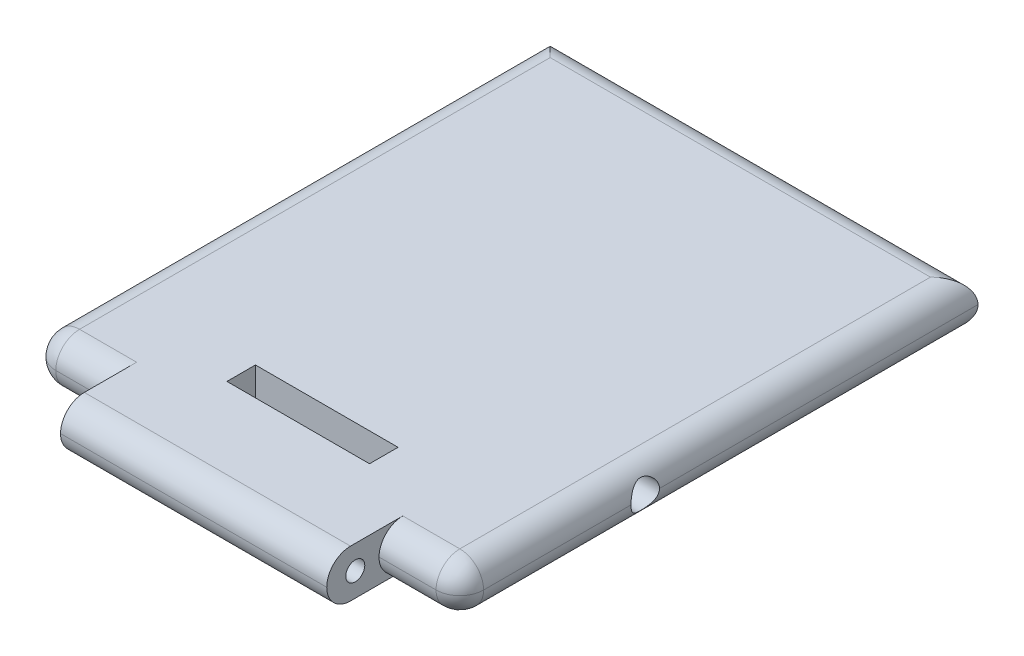
ISO-10303-21;
HEADER;
FILE_DESCRIPTION(('STEP AP214'),'2;1');
FILE_NAME('part.step','',(''),(''),'','','');
FILE_SCHEMA(('AUTOMOTIVE_DESIGN { 1 0 10303 214 1 1 1 1 }'));
ENDSEC;
DATA;
#1=APPLICATION_CONTEXT('core data for automotive mechanical design processes');
#2=APPLICATION_PROTOCOL_DEFINITION('international standard','automotive_design',2000,#1);
#3=PRODUCT_CONTEXT('',#1,'mechanical');
#4=PRODUCT('Part','Part','',(#3));
#5=PRODUCT_RELATED_PRODUCT_CATEGORY('part','',(#4));
#6=PRODUCT_DEFINITION_FORMATION('','',#4);
#7=PRODUCT_DEFINITION_CONTEXT('part definition',#1,'design');
#8=PRODUCT_DEFINITION('design','',#6,#7);
#9=PRODUCT_DEFINITION_SHAPE('','',#8);
#10=(LENGTH_UNIT() NAMED_UNIT(*) SI_UNIT(.MILLI.,.METRE.));
#11=(NAMED_UNIT(*) PLANE_ANGLE_UNIT() SI_UNIT($,.RADIAN.));
#12=(NAMED_UNIT(*) SI_UNIT($,.STERADIAN.) SOLID_ANGLE_UNIT());
#13=UNCERTAINTY_MEASURE_WITH_UNIT(LENGTH_MEASURE(1.E-05),#10,'distance_accuracy_value','');
#14=(GEOMETRIC_REPRESENTATION_CONTEXT(3) GLOBAL_UNCERTAINTY_ASSIGNED_CONTEXT((#13)) GLOBAL_UNIT_ASSIGNED_CONTEXT((#10,
#11,#12)) REPRESENTATION_CONTEXT('',''));
#15=CARTESIAN_POINT('',(0.,0.,0.));
#16=DIRECTION('',(0.,0.,1.));
#17=DIRECTION('',(1.,0.,0.));
#18=AXIS2_PLACEMENT_3D('',#15,#16,#17);
#19=CARTESIAN_POINT('',(-20.,0.,0.));
#20=DIRECTION('',(0.,0.,-1.));
#21=DIRECTION('',(-1.,0.,0.));
#22=AXIS2_PLACEMENT_3D('',#19,#20,#21);
#23=CYLINDRICAL_SURFACE('',#22,2.5);
#24=DIRECTION('',(0.,0.,1.));
#25=VECTOR('',#24,1.);
#26=CARTESIAN_POINT('',(-22.5,0.,-30.));
#27=LINE('',#26,#25);
#28=CARTESIAN_POINT('',(-22.5,0.,3.5));
#29=VERTEX_POINT('',#28);
#30=CARTESIAN_POINT('',(-22.5,0.,-30.));
#31=VERTEX_POINT('',#30);
#32=EDGE_CURVE('E176',#29,#31,#27,.F.);
#33=ORIENTED_EDGE('',*,*,#32,.F.);
#34=CARTESIAN_POINT('',(-22.5,0.,3.5));
#35=CARTESIAN_POINT('',(-22.5000044393078,0.0385814004818396,3.49999721546958));
#36=CARTESIAN_POINT('',(-22.4991059461024,0.0771415674825016,3.5014895912147));
#37=CARTESIAN_POINT('',(-22.4955516212392,0.153933720325979,3.50742294563337));
#38=CARTESIAN_POINT('',(-22.4928966764006,0.192165861924006,3.51186243633485));
#39=CARTESIAN_POINT('',(-22.4824133452094,0.305515608465147,3.52946602749674));
#40=CARTESIAN_POINT('',(-22.4720651518234,0.379786208449342,3.5469164948956));
#41=CARTESIAN_POINT('',(-22.4456254792361,0.523717422888231,3.59237010561794));
#42=CARTESIAN_POINT('',(-22.429543092635,0.593385129935151,3.62035654615306));
#43=CARTESIAN_POINT('',(-22.3929831093628,0.726933408093366,3.68580623368843));
#44=CARTESIAN_POINT('',(-22.3725002969015,0.790806982564218,3.72328073630663));
#45=CARTESIAN_POINT('',(-22.3270514917775,0.916306643350075,3.80977892638183));
#46=CARTESIAN_POINT('',(-22.3018633704501,0.977395457980457,3.85946268647684));
#47=CARTESIAN_POINT('',(-22.2502996304999,1.09089176245314,3.96747772201137));
#48=CARTESIAN_POINT('',(-22.223922723787,1.1432895329452,4.02581854254182));
#49=CARTESIAN_POINT('',(-22.1691105383343,1.24445033696731,4.15792383318339));
#50=CARTESIAN_POINT('',(-22.1408199117211,1.29197814210969,4.23270247276361));
#51=CARTESIAN_POINT('',(-22.0893827947207,1.37361466763903,4.39084735877262));
#52=CARTESIAN_POINT('',(-22.0662279351703,1.40774529078447,4.47419930489061));
#53=CARTESIAN_POINT('',(-22.0335463907735,1.45440588845967,4.62659601132903));
#54=CARTESIAN_POINT('',(-22.022078983889,1.47016176402116,4.69423509419494));
#55=CARTESIAN_POINT('',(-22.005903146887,1.49216163757828,4.83180278141852));
#56=CARTESIAN_POINT('',(-22.0011864032256,1.49841733576744,4.90172846100189));
#57=CARTESIAN_POINT('',(-21.9992092222717,1.50105509186428,5.04201164826098));
#58=CARTESIAN_POINT('',(-22.0019633823942,1.49741781983877,5.11236973295184));
#59=CARTESIAN_POINT('',(-22.0145326572401,1.48046054476459,5.25127907563448));
#60=CARTESIAN_POINT('',(-22.0243530522272,1.46713330077918,5.31982894269715));
#61=CARTESIAN_POINT('',(-22.0495319174815,1.43173915740479,5.45253049552673));
#62=CARTESIAN_POINT('',(-22.064817233501,1.40978734105082,5.5167275462438));
#63=CARTESIAN_POINT('',(-22.0992706633852,1.35795036175845,5.64069545879761));
#64=CARTESIAN_POINT('',(-22.1184401701158,1.32806235171398,5.70046472230596));
#65=CARTESIAN_POINT('',(-22.1625525993146,1.25518104106243,5.82498219388955));
#66=CARTESIAN_POINT('',(-22.1879189881197,1.21081016017397,5.88877444027665));
#67=CARTESIAN_POINT('',(-22.2393045609473,1.11291350322469,6.00867341086113));
#68=CARTESIAN_POINT('',(-22.2653243823146,1.05937846722629,6.06477225695369));
#69=CARTESIAN_POINT('',(-22.319359208429,0.935803921168379,6.17562140463223));
#70=CARTESIAN_POINT('',(-22.3471461878551,0.864503841812067,6.22909188290035));
#71=CARTESIAN_POINT('',(-22.3977314873248,0.712244675848721,6.32313540947742));
#72=CARTESIAN_POINT('',(-22.4205339367657,0.631293671068322,6.36371914642647));
#73=CARTESIAN_POINT('',(-22.4548196029919,0.478302472498111,6.42359184069723));
#74=CARTESIAN_POINT('',(-22.467639890452,0.407574199222205,6.4454830783274));
#75=CARTESIAN_POINT('',(-22.4871980344502,0.262934036845273,6.4786268437014));
#76=CARTESIAN_POINT('',(-22.4939506394922,0.18903032729998,6.48990517104717));
#77=CARTESIAN_POINT('',(-22.4982460622018,0.0955848699627612,6.49707482394523));
#78=CARTESIAN_POINT('',(-22.498903526115,0.0764812683724517,6.49817174191381));
#79=CARTESIAN_POINT('',(-22.4997798794058,0.0382541496933018,6.49963341977961));
#80=CARTESIAN_POINT('',(-22.4999991837261,0.0191306686226421,6.4999988723841));
#81=CARTESIAN_POINT('',(-22.5,0.,6.50000000000001));
#82=B_SPLINE_CURVE_WITH_KNOTS('',3,(#34,#35,#36,#37,#38,#39,#40,#41,#42,#43,#44,#45,#46,#47,#48,
#49,#50,#51,#52,#53,#54,#55,#56,#57,#58,#59,#60,#61,#62,#63,#64,#65,#66,#67,#68,#69,#70,#71,#72,
#73,#74,#75,#76,#77,#78,#79,#80,#81),.UNSPECIFIED.,.F.,.F.,(4,2,2,2,2,2,2,2,2,2,2,2,2,2,2,2,2,2,
2,2,2,2,2,4),(0.,0.115664120203099,0.231269886993216,0.461003678278137,0.690374793435718,
0.920019295308536,1.1670692627372,1.4143936745253,1.69207052751252,1.96929150285475,
2.17956799484947,2.38958530467528,2.60001326320507,2.81059862813212,3.01846457428348,
3.22640519324174,3.47069421075595,3.71523154357855,3.99388188884001,4.27230050596576,
4.49678090538653,4.72071418048354,4.77814150578977,4.83551442088689),.UNSPECIFIED.);
#83=CARTESIAN_POINT('',(-22.5,0.,6.50000000000001));
#84=VERTEX_POINT('',#83);
#85=EDGE_CURVE('E53',#29,#84,#82,.T.);
#86=ORIENTED_EDGE('',*,*,#85,.T.);
#87=CARTESIAN_POINT('',(-22.5,0.,22.));
#88=VERTEX_POINT('',#87);
#89=EDGE_CURVE('E173',#88,#84,#27,.F.);
#90=ORIENTED_EDGE('',*,*,#89,.F.);
#91=CARTESIAN_POINT('',(-20.,0.,22.));
#92=DIRECTION('',(0.,0.,1.));
#93=DIRECTION('',(1.,0.,0.));
#94=AXIS2_PLACEMENT_3D('',#91,#92,#93);
#95=CIRCLE('',#94,2.5);
#96=CARTESIAN_POINT('',(-20.,2.5,22.));
#97=VERTEX_POINT('',#96);
#98=EDGE_CURVE('E194',#88,#97,#95,.F.);
#99=ORIENTED_EDGE('',*,*,#98,.T.);
#100=DIRECTION('',(0.,0.,1.));
#101=VECTOR('',#100,1.);
#102=CARTESIAN_POINT('',(-20.,2.5,24.5));
#103=LINE('',#102,#101);
#104=CARTESIAN_POINT('',(-20.,2.5,-27.5));
#105=VERTEX_POINT('',#104);
#106=EDGE_CURVE('E611',#105,#97,#103,.T.);
#107=ORIENTED_EDGE('',*,*,#106,.F.);
#108=CARTESIAN_POINT('',(-20.,0.,-27.5));
#109=DIRECTION('',(0.707106781186547,0.,-0.707106781186548));
#110=DIRECTION('',(0.707106781186547,0.,0.707106781186547));
#111=AXIS2_PLACEMENT_3D('',#108,#109,#110);
#112=ELLIPSE('',#111,3.53553390593274,2.5);
#113=EDGE_CURVE('E184',#31,#105,#112,.T.);
#114=ORIENTED_EDGE('',*,*,#113,.F.);
#115=EDGE_LOOP('',(#33,#86,#90,#99,#107,#114));
#116=FACE_BOUND('',#115,.T.);
#117=ADVANCED_FACE('F33',(#116),#23,.T.);
#118=CARTESIAN_POINT('',(-20.,0.,-30.));
#119=DIRECTION('',(0.,0.,1.));
#120=DIRECTION('',(1.,0.,0.));
#121=AXIS2_PLACEMENT_3D('',#118,#119,#120);
#122=CYLINDRICAL_SURFACE('',#121,2.5);
#123=ORIENTED_EDGE('',*,*,#89,.T.);
#124=CARTESIAN_POINT('',(-22.5,0.,6.50000000000001));
#125=CARTESIAN_POINT('',(-22.5000044393078,-0.0385814004818392,6.50000278453043));
#126=CARTESIAN_POINT('',(-22.4991059461024,-0.0771415674825013,6.49851040878531));
#127=CARTESIAN_POINT('',(-22.4955516212392,-0.153933720325979,6.49257705436664));
#128=CARTESIAN_POINT('',(-22.4928966764006,-0.192165861924006,6.48813756366516));
#129=CARTESIAN_POINT('',(-22.4824133452094,-0.305515608465147,6.47053397250327));
#130=CARTESIAN_POINT('',(-22.4720651518234,-0.379786208449342,6.45308350510441));
#131=CARTESIAN_POINT('',(-22.4456254792361,-0.523717422888231,6.40762989438207));
#132=CARTESIAN_POINT('',(-22.429543092635,-0.593385129935151,6.37964345384695));
#133=CARTESIAN_POINT('',(-22.3929831093628,-0.726933408093366,6.31419376631158));
#134=CARTESIAN_POINT('',(-22.3725002969015,-0.790806982564218,6.27671926369338));
#135=CARTESIAN_POINT('',(-22.3270514917775,-0.916306643350075,6.19022107361818));
#136=CARTESIAN_POINT('',(-22.3018633704501,-0.977395457980457,6.14053731352317));
#137=CARTESIAN_POINT('',(-22.2502996305,-1.09089176245313,6.03252227798864));
#138=CARTESIAN_POINT('',(-22.223922723787,-1.1432895329452,5.97418145745819));
#139=CARTESIAN_POINT('',(-22.1691105383343,-1.24445033696731,5.84207616681662));
#140=CARTESIAN_POINT('',(-22.1408199117211,-1.29197814210969,5.7672975272364));
#141=CARTESIAN_POINT('',(-22.0893827947207,-1.37361466763903,5.60915264122738));
#142=CARTESIAN_POINT('',(-22.0662279351703,-1.40774529078447,5.5258006951094));
#143=CARTESIAN_POINT('',(-22.0335463907735,-1.45440588845967,5.37340398867098));
#144=CARTESIAN_POINT('',(-22.022078983889,-1.47016176402116,5.30576490580506));
#145=CARTESIAN_POINT('',(-22.005903146887,-1.49216163757828,5.16819721858149));
#146=CARTESIAN_POINT('',(-22.0011864032256,-1.49841733576744,5.09827153899811));
#147=CARTESIAN_POINT('',(-21.9992092222717,-1.50105509186428,4.95798835173902));
#148=CARTESIAN_POINT('',(-22.0019633823942,-1.49741781983877,4.88763026704816));
#149=CARTESIAN_POINT('',(-22.0145326572401,-1.48046054476459,4.74872092436553));
#150=CARTESIAN_POINT('',(-22.0243530522272,-1.46713330077918,4.68017105730286));
#151=CARTESIAN_POINT('',(-22.0495319174815,-1.43173915740478,4.54746950447328));
#152=CARTESIAN_POINT('',(-22.064817233501,-1.40978734105082,4.48327245375621));
#153=CARTESIAN_POINT('',(-22.0992706633852,-1.35795036175845,4.3593045412024));
#154=CARTESIAN_POINT('',(-22.1184401701158,-1.32806235171398,4.29953527769404));
#155=CARTESIAN_POINT('',(-22.1625525993146,-1.25518104106243,4.17501780611045));
#156=CARTESIAN_POINT('',(-22.1879189881197,-1.21081016017397,4.11122555972335));
#157=CARTESIAN_POINT('',(-22.2393045609473,-1.11291350322469,3.99132658913888));
#158=CARTESIAN_POINT('',(-22.2653243823147,-1.05937846722629,3.93522774304632));
#159=CARTESIAN_POINT('',(-22.319359208429,-0.935803921168375,3.82437859536778));
#160=CARTESIAN_POINT('',(-22.3471461878551,-0.864503841812062,3.77090811709966));
#161=CARTESIAN_POINT('',(-22.3977314873248,-0.712244675848716,3.67686459052259));
#162=CARTESIAN_POINT('',(-22.4205339367657,-0.631293671068317,3.63628085357354));
#163=CARTESIAN_POINT('',(-22.4548196029919,-0.478302472498106,3.57640815930278));
#164=CARTESIAN_POINT('',(-22.467639890452,-0.407574199222199,3.55451692167261));
#165=CARTESIAN_POINT('',(-22.4871980344502,-0.262934036845267,3.5213731562986));
#166=CARTESIAN_POINT('',(-22.4939506394922,-0.189030327299974,3.51009482895284));
#167=CARTESIAN_POINT('',(-22.4982460622018,-0.0955848699627559,3.50292517605478));
#168=CARTESIAN_POINT('',(-22.498903526115,-0.0764812683724476,3.5018282580862));
#169=CARTESIAN_POINT('',(-22.4997798794059,-0.0382541496932998,3.5003665802204));
#170=CARTESIAN_POINT('',(-22.4999991837261,-0.019130668622641,3.50000112761591));
#171=CARTESIAN_POINT('',(-22.5,0.,3.5));
#172=B_SPLINE_CURVE_WITH_KNOTS('',3,(#124,#125,#126,#127,#128,#129,#130,#131,#132,#133,#134,
#135,#136,#137,#138,#139,#140,#141,#142,#143,#144,#145,#146,#147,#148,#149,#150,#151,#152,#153,
#154,#155,#156,#157,#158,#159,#160,#161,#162,#163,#164,#165,#166,#167,#168,#169,#170,#171),
.UNSPECIFIED.,.F.,.F.,(4,2,2,2,2,2,2,2,2,2,2,2,2,2,2,2,2,2,2,2,2,2,2,4),(0.,0.115664120203099,
0.231269886993216,0.461003678278138,0.690374793435719,0.920019295308536,1.1670692627372,
1.4143936745253,1.69207052751252,1.96929150285475,2.17956799484947,2.38958530467528,
2.60001326320508,2.81059862813213,3.01846457428349,3.22640519324175,3.47069421075596,
3.71523154357855,3.99388188884002,4.27230050596577,4.49678090538653,4.72071418048355,
4.77814150578978,4.83551442088689),.UNSPECIFIED.);
#173=EDGE_CURVE('E11',#84,#29,#172,.T.);
#174=ORIENTED_EDGE('',*,*,#173,.T.);
#175=ORIENTED_EDGE('',*,*,#32,.T.);
#176=CARTESIAN_POINT('',(-20.,0.,-27.5));
#177=DIRECTION('',(-0.707106781186547,0.,0.707106781186548));
#178=DIRECTION('',(0.707106781186547,0.,0.707106781186547));
#179=AXIS2_PLACEMENT_3D('',#176,#177,#178);
#180=ELLIPSE('',#179,3.53553390593274,2.5);
#181=CARTESIAN_POINT('',(-20.,-2.5,-27.5));
#182=VERTEX_POINT('',#181);
#183=EDGE_CURVE('E590',#182,#31,#180,.F.);
#184=ORIENTED_EDGE('',*,*,#183,.F.);
#185=DIRECTION('',(0.,0.,1.));
#186=VECTOR('',#185,1.);
#187=CARTESIAN_POINT('',(-20.,-2.5,0.));
#188=LINE('',#187,#186);
#189=CARTESIAN_POINT('',(-20.,-2.5,22.));
#190=VERTEX_POINT('',#189);
#191=EDGE_CURVE('E609',#190,#182,#188,.F.);
#192=ORIENTED_EDGE('',*,*,#191,.F.);
#193=CARTESIAN_POINT('',(-20.,0.,22.));
#194=DIRECTION('',(0.,0.,1.));
#195=DIRECTION('',(0.,-1.,0.));
#196=AXIS2_PLACEMENT_3D('',#193,#194,#195);
#197=CIRCLE('',#196,2.5);
#198=EDGE_CURVE('E183',#190,#88,#197,.F.);
#199=ORIENTED_EDGE('',*,*,#198,.T.);
#200=EDGE_LOOP('',(#123,#174,#175,#184,#192,#199));
#201=FACE_BOUND('',#200,.T.);
#202=ADVANCED_FACE('F180',(#201),#122,.T.);
#203=CARTESIAN_POINT('',(0.,2.5,0.));
#204=DIRECTION('',(0.,1.,0.));
#205=DIRECTION('',(0.,0.,1.));
#206=AXIS2_PLACEMENT_3D('',#203,#204,#205);
#207=PLANE('',#206);
#208=DIRECTION('',(0.,0.,1.));
#209=VECTOR('',#208,1.);
#210=CARTESIAN_POINT('',(7.5,2.5,19.));
#211=LINE('',#210,#209);
#212=CARTESIAN_POINT('',(7.5,2.5,16.));
#213=VERTEX_POINT('',#212);
#214=CARTESIAN_POINT('',(7.5,2.5,19.));
#215=VERTEX_POINT('',#214);
#216=EDGE_CURVE('E246',#213,#215,#211,.T.);
#217=ORIENTED_EDGE('',*,*,#216,.T.);
#218=DIRECTION('',(-1.,0.,0.));
#219=VECTOR('',#218,1.);
#220=CARTESIAN_POINT('',(-7.5,2.5,19.));
#221=LINE('',#220,#219);
#222=CARTESIAN_POINT('',(-7.5,2.5,19.));
#223=VERTEX_POINT('',#222);
#224=EDGE_CURVE('E658',#215,#223,#221,.T.);
#225=ORIENTED_EDGE('',*,*,#224,.T.);
#226=DIRECTION('',(0.,0.,-1.));
#227=VECTOR('',#226,1.);
#228=CARTESIAN_POINT('',(-7.5,2.5,19.));
#229=LINE('',#228,#227);
#230=CARTESIAN_POINT('',(-7.5,2.5,16.));
#231=VERTEX_POINT('',#230);
#232=EDGE_CURVE('E656',#223,#231,#229,.T.);
#233=ORIENTED_EDGE('',*,*,#232,.T.);
#234=DIRECTION('',(1.,0.,0.));
#235=VECTOR('',#234,1.);
#236=CARTESIAN_POINT('',(-7.5,2.5,16.));
#237=LINE('',#236,#235);
#238=EDGE_CURVE('E647',#231,#213,#237,.T.);
#239=ORIENTED_EDGE('',*,*,#238,.T.);
#240=EDGE_LOOP('',(#217,#225,#233,#239));
#241=FACE_BOUND('',#240,.T.);
#242=DIRECTION('',(0.,0.,-1.));
#243=VECTOR('',#242,1.);
#244=CARTESIAN_POINT('',(-14.,2.5,0.));
#245=LINE('',#244,#243);
#246=CARTESIAN_POINT('',(-14.,2.5,27.5));
#247=VERTEX_POINT('',#246);
#248=CARTESIAN_POINT('',(-14.,2.5,22.));
#249=VERTEX_POINT('',#248);
#250=EDGE_CURVE('E532',#247,#249,#245,.T.);
#251=ORIENTED_EDGE('',*,*,#250,.F.);
#252=DIRECTION('',(1.,0.,0.));
#253=VECTOR('',#252,1.);
#254=CARTESIAN_POINT('',(14.,2.5,27.5));
#255=LINE('',#254,#253);
#256=CARTESIAN_POINT('',(14.,2.5,27.5));
#257=VERTEX_POINT('',#256);
#258=EDGE_CURVE('E534',#247,#257,#255,.T.);
#259=ORIENTED_EDGE('',*,*,#258,.T.);
#260=DIRECTION('',(0.,0.,-1.));
#261=VECTOR('',#260,1.);
#262=CARTESIAN_POINT('',(14.,2.5,0.));
#263=LINE('',#262,#261);
#264=CARTESIAN_POINT('',(14.,2.5,22.));
#265=VERTEX_POINT('',#264);
#266=EDGE_CURVE('E541',#257,#265,#263,.T.);
#267=ORIENTED_EDGE('',*,*,#266,.T.);
#268=DIRECTION('',(1.,0.,0.));
#269=VECTOR('',#268,1.);
#270=CARTESIAN_POINT('',(0.,2.5,22.));
#271=LINE('',#270,#269);
#272=CARTESIAN_POINT('',(20.,2.5,22.));
#273=VERTEX_POINT('',#272);
#274=EDGE_CURVE('E552',#265,#273,#271,.T.);
#275=ORIENTED_EDGE('',*,*,#274,.T.);
#276=DIRECTION('',(0.,0.,-1.));
#277=VECTOR('',#276,1.);
#278=CARTESIAN_POINT('',(20.,2.5,-30.));
#279=LINE('',#278,#277);
#280=CARTESIAN_POINT('',(20.,2.5,-27.5));
#281=VERTEX_POINT('',#280);
#282=EDGE_CURVE('E600',#273,#281,#279,.T.);
#283=ORIENTED_EDGE('',*,*,#282,.T.);
#284=DIRECTION('',(-1.,0.,0.));
#285=VECTOR('',#284,1.);
#286=CARTESIAN_POINT('',(-22.5,2.5,-27.5));
#287=LINE('',#286,#285);
#288=EDGE_CURVE('E603',#281,#105,#287,.T.);
#289=ORIENTED_EDGE('',*,*,#288,.T.);
#290=ORIENTED_EDGE('',*,*,#106,.T.);
#291=DIRECTION('',(-1.,0.,0.));
#292=VECTOR('',#291,1.);
#293=CARTESIAN_POINT('',(-14.,2.5,22.));
#294=LINE('',#293,#292);
#295=EDGE_CURVE('E537',#97,#249,#294,.F.);
#296=ORIENTED_EDGE('',*,*,#295,.T.);
#297=EDGE_LOOP('',(#251,#259,#267,#275,#283,#289,#290,#296));
#298=FACE_BOUND('',#297,.T.);
#299=ADVANCED_FACE('F258',(#241,#298),#207,.T.);
#300=CARTESIAN_POINT('',(0.,-2.5,0.));
#301=DIRECTION('',(0.,1.,0.));
#302=DIRECTION('',(0.,0.,1.));
#303=AXIS2_PLACEMENT_3D('',#300,#301,#302);
#304=PLANE('',#303);
#305=DIRECTION('',(1.,0.,0.));
#306=VECTOR('',#305,1.);
#307=CARTESIAN_POINT('',(0.,-2.5,19.));
#308=LINE('',#307,#306);
#309=CARTESIAN_POINT('',(-7.5,-2.5,19.));
#310=VERTEX_POINT('',#309);
#311=CARTESIAN_POINT('',(7.5,-2.5,19.));
#312=VERTEX_POINT('',#311);
#313=EDGE_CURVE('E206',#310,#312,#308,.T.);
#314=ORIENTED_EDGE('',*,*,#313,.T.);
#315=DIRECTION('',(0.,0.,-1.));
#316=VECTOR('',#315,1.);
#317=CARTESIAN_POINT('',(7.49999999999999,-2.5,0.));
#318=LINE('',#317,#316);
#319=CARTESIAN_POINT('',(7.5,-2.5,16.));
#320=VERTEX_POINT('',#319);
#321=EDGE_CURVE('E216',#312,#320,#318,.T.);
#322=ORIENTED_EDGE('',*,*,#321,.T.);
#323=DIRECTION('',(-1.,0.,0.));
#324=VECTOR('',#323,1.);
#325=CARTESIAN_POINT('',(0.,-2.5,16.));
#326=LINE('',#325,#324);
#327=CARTESIAN_POINT('',(-7.5,-2.5,16.));
#328=VERTEX_POINT('',#327);
#329=EDGE_CURVE('E213',#320,#328,#326,.T.);
#330=ORIENTED_EDGE('',*,*,#329,.T.);
#331=DIRECTION('',(0.,0.,1.));
#332=VECTOR('',#331,1.);
#333=CARTESIAN_POINT('',(-7.49999999999999,-2.5,0.));
#334=LINE('',#333,#332);
#335=EDGE_CURVE('E209',#328,#310,#334,.T.);
#336=ORIENTED_EDGE('',*,*,#335,.T.);
#337=EDGE_LOOP('',(#314,#322,#330,#336));
#338=FACE_BOUND('',#337,.T.);
#339=DIRECTION('',(0.,0.,-1.));
#340=VECTOR('',#339,1.);
#341=CARTESIAN_POINT('',(14.,-2.5,0.));
#342=LINE('',#341,#340);
#343=CARTESIAN_POINT('',(14.,-2.5,27.5));
#344=VERTEX_POINT('',#343);
#345=CARTESIAN_POINT('',(14.,-2.5,22.));
#346=VERTEX_POINT('',#345);
#347=EDGE_CURVE('E639',#344,#346,#342,.T.);
#348=ORIENTED_EDGE('',*,*,#347,.F.);
#349=DIRECTION('',(1.,0.,0.));
#350=VECTOR('',#349,1.);
#351=CARTESIAN_POINT('',(0.,-2.5,27.5));
#352=LINE('',#351,#350);
#353=CARTESIAN_POINT('',(-14.,-2.5,27.5));
#354=VERTEX_POINT('',#353);
#355=EDGE_CURVE('E619',#344,#354,#352,.F.);
#356=ORIENTED_EDGE('',*,*,#355,.T.);
#357=DIRECTION('',(0.,0.,-1.));
#358=VECTOR('',#357,1.);
#359=CARTESIAN_POINT('',(-14.,-2.5,0.));
#360=LINE('',#359,#358);
#361=CARTESIAN_POINT('',(-14.,-2.5,22.));
#362=VERTEX_POINT('',#361);
#363=EDGE_CURVE('E638',#354,#362,#360,.T.);
#364=ORIENTED_EDGE('',*,*,#363,.T.);
#365=DIRECTION('',(-1.,0.,0.));
#366=VECTOR('',#365,1.);
#367=CARTESIAN_POINT('',(0.,-2.5,22.));
#368=LINE('',#367,#366);
#369=EDGE_CURVE('E625',#362,#190,#368,.T.);
#370=ORIENTED_EDGE('',*,*,#369,.T.);
#371=ORIENTED_EDGE('',*,*,#191,.T.);
#372=DIRECTION('',(-1.,0.,0.));
#373=VECTOR('',#372,1.);
#374=CARTESIAN_POINT('',(0.,-2.5,-27.5));
#375=LINE('',#374,#373);
#376=CARTESIAN_POINT('',(20.,-2.5,-27.5));
#377=VERTEX_POINT('',#376);
#378=EDGE_CURVE('E608',#182,#377,#375,.F.);
#379=ORIENTED_EDGE('',*,*,#378,.T.);
#380=DIRECTION('',(0.,0.,-1.));
#381=VECTOR('',#380,1.);
#382=CARTESIAN_POINT('',(20.,-2.5,0.));
#383=LINE('',#382,#381);
#384=CARTESIAN_POINT('',(20.,-2.5,22.));
#385=VERTEX_POINT('',#384);
#386=EDGE_CURVE('E627',#377,#385,#383,.F.);
#387=ORIENTED_EDGE('',*,*,#386,.T.);
#388=DIRECTION('',(1.,0.,0.));
#389=VECTOR('',#388,1.);
#390=CARTESIAN_POINT('',(14.,-2.5,22.));
#391=LINE('',#390,#389);
#392=EDGE_CURVE('E622',#385,#346,#391,.F.);
#393=ORIENTED_EDGE('',*,*,#392,.T.);
#394=EDGE_LOOP('',(#348,#356,#364,#370,#371,#379,#387,#393));
#395=FACE_BOUND('',#394,.T.);
#396=ADVANCED_FACE('F445',(#338,#395),#304,.F.);
#397=CARTESIAN_POINT('',(14.,-2.5,0.));
#398=DIRECTION('',(1.,0.,0.));
#399=DIRECTION('',(0.,0.,-1.));
#400=AXIS2_PLACEMENT_3D('',#397,#398,#399);
#401=PLANE('',#400);
#402=CARTESIAN_POINT('',(14.,0.,27.));
#403=DIRECTION('',(1.,0.,0.));
#404=DIRECTION('',(0.,0.,-1.));
#405=AXIS2_PLACEMENT_3D('',#402,#403,#404);
#406=CIRCLE('',#405,1.);
#407=CARTESIAN_POINT('',(14.,0.,26.));
#408=VERTEX_POINT('',#407);
#409=EDGE_CURVE('E635',#408,#408,#406,.T.);
#410=ORIENTED_EDGE('',*,*,#409,.F.);
#411=EDGE_LOOP('',(#410));
#412=FACE_BOUND('',#411,.T.);
#413=CARTESIAN_POINT('',(14.,0.,27.5));
#414=DIRECTION('',(1.,0.,0.));
#415=DIRECTION('',(0.,0.,-1.));
#416=AXIS2_PLACEMENT_3D('',#413,#414,#415);
#417=CIRCLE('',#416,2.5);
#418=CARTESIAN_POINT('',(14.,0.,30.));
#419=VERTEX_POINT('',#418);
#420=EDGE_CURVE('E540',#257,#419,#417,.T.);
#421=ORIENTED_EDGE('',*,*,#420,.T.);
#422=CARTESIAN_POINT('',(14.,0.,27.5));
#423=DIRECTION('',(1.,0.,0.));
#424=DIRECTION('',(0.,0.,-1.));
#425=AXIS2_PLACEMENT_3D('',#422,#423,#424);
#426=CIRCLE('',#425,2.5);
#427=EDGE_CURVE('E631',#419,#344,#426,.T.);
#428=ORIENTED_EDGE('',*,*,#427,.T.);
#429=ORIENTED_EDGE('',*,*,#347,.T.);
#430=CARTESIAN_POINT('',(14.,0.,22.));
#431=DIRECTION('',(1.,0.,0.));
#432=DIRECTION('',(0.,0.,-1.));
#433=AXIS2_PLACEMENT_3D('',#430,#431,#432);
#434=CIRCLE('',#433,2.5);
#435=CARTESIAN_POINT('',(14.,0.,24.5));
#436=VERTEX_POINT('',#435);
#437=EDGE_CURVE('E548',#346,#436,#434,.F.);
#438=ORIENTED_EDGE('',*,*,#437,.T.);
#439=CARTESIAN_POINT('',(14.,0.,22.));
#440=DIRECTION('',(1.,0.,0.));
#441=DIRECTION('',(0.,0.,-1.));
#442=AXIS2_PLACEMENT_3D('',#439,#440,#441);
#443=CIRCLE('',#442,2.5);
#444=EDGE_CURVE('E550',#436,#265,#443,.F.);
#445=ORIENTED_EDGE('',*,*,#444,.T.);
#446=ORIENTED_EDGE('',*,*,#266,.F.);
#447=EDGE_LOOP('',(#421,#428,#429,#438,#445,#446));
#448=FACE_BOUND('',#447,.T.);
#449=ADVANCED_FACE('F438',(#412,#448),#401,.T.);
#450=CARTESIAN_POINT('',(-14.,-2.5,0.));
#451=DIRECTION('',(1.,0.,0.));
#452=DIRECTION('',(0.,0.,-1.));
#453=AXIS2_PLACEMENT_3D('',#450,#451,#452);
#454=PLANE('',#453);
#455=CARTESIAN_POINT('',(-14.,0.,27.));
#456=DIRECTION('',(1.,0.,0.));
#457=DIRECTION('',(0.,0.,-1.));
#458=AXIS2_PLACEMENT_3D('',#455,#456,#457);
#459=CIRCLE('',#458,1.);
#460=CARTESIAN_POINT('',(-14.,0.,26.));
#461=VERTEX_POINT('',#460);
#462=EDGE_CURVE('E563',#461,#461,#459,.T.);
#463=ORIENTED_EDGE('',*,*,#462,.T.);
#464=EDGE_LOOP('',(#463));
#465=FACE_BOUND('',#464,.T.);
#466=ORIENTED_EDGE('',*,*,#363,.F.);
#467=CARTESIAN_POINT('',(-14.,0.,27.5));
#468=DIRECTION('',(1.,0.,0.));
#469=DIRECTION('',(0.,0.,-1.));
#470=AXIS2_PLACEMENT_3D('',#467,#468,#469);
#471=CIRCLE('',#470,2.5);
#472=CARTESIAN_POINT('',(-14.,0.,30.));
#473=VERTEX_POINT('',#472);
#474=EDGE_CURVE('E616',#354,#473,#471,.F.);
#475=ORIENTED_EDGE('',*,*,#474,.T.);
#476=CARTESIAN_POINT('',(-14.,0.,27.5));
#477=DIRECTION('',(1.,0.,0.));
#478=DIRECTION('',(0.,0.,-1.));
#479=AXIS2_PLACEMENT_3D('',#476,#477,#478);
#480=CIRCLE('',#479,2.5);
#481=EDGE_CURVE('E546',#473,#247,#480,.F.);
#482=ORIENTED_EDGE('',*,*,#481,.T.);
#483=ORIENTED_EDGE('',*,*,#250,.T.);
#484=CARTESIAN_POINT('',(-14.,0.,22.));
#485=DIRECTION('',(1.,0.,0.));
#486=DIRECTION('',(0.,0.,-1.));
#487=AXIS2_PLACEMENT_3D('',#484,#485,#486);
#488=CIRCLE('',#487,2.5);
#489=CARTESIAN_POINT('',(-14.,0.,24.5));
#490=VERTEX_POINT('',#489);
#491=EDGE_CURVE('E210',#249,#490,#488,.T.);
#492=ORIENTED_EDGE('',*,*,#491,.T.);
#493=CARTESIAN_POINT('',(-14.,0.,22.));
#494=DIRECTION('',(1.,0.,0.));
#495=DIRECTION('',(0.,0.,-1.));
#496=AXIS2_PLACEMENT_3D('',#493,#494,#495);
#497=CIRCLE('',#496,2.5);
#498=EDGE_CURVE('E558',#490,#362,#497,.T.);
#499=ORIENTED_EDGE('',*,*,#498,.T.);
#500=EDGE_LOOP('',(#466,#475,#482,#483,#492,#499));
#501=FACE_BOUND('',#500,.T.);
#502=ADVANCED_FACE('F430',(#465,#501),#454,.F.);
#503=CARTESIAN_POINT('',(22.5,0.,27.));
#504=DIRECTION('',(-1.,0.,0.));
#505=DIRECTION('',(0.,0.,1.));
#506=AXIS2_PLACEMENT_3D('',#503,#504,#505);
#507=CYLINDRICAL_SURFACE('',#506,1.);
#508=ORIENTED_EDGE('',*,*,#409,.T.);
#509=EDGE_LOOP('',(#508));
#510=FACE_BOUND('',#509,.T.);
#511=ORIENTED_EDGE('',*,*,#462,.F.);
#512=EDGE_LOOP('',(#511));
#513=FACE_BOUND('',#512,.T.);
#514=ADVANCED_FACE('F421',(#510,#513),#507,.F.);
#515=CARTESIAN_POINT('',(0.,0.,27.5));
#516=DIRECTION('',(-1.,0.,0.));
#517=DIRECTION('',(0.,0.,1.));
#518=AXIS2_PLACEMENT_3D('',#515,#516,#517);
#519=CYLINDRICAL_SURFACE('',#518,2.5);
#520=ORIENTED_EDGE('',*,*,#258,.F.);
#521=ORIENTED_EDGE('',*,*,#481,.F.);
#522=DIRECTION('',(1.,0.,0.));
#523=VECTOR('',#522,1.);
#524=CARTESIAN_POINT('',(-14.,0.,30.));
#525=LINE('',#524,#523);
#526=EDGE_CURVE('E205',#419,#473,#525,.F.);
#527=ORIENTED_EDGE('',*,*,#526,.F.);
#528=ORIENTED_EDGE('',*,*,#420,.F.);
#529=EDGE_LOOP('',(#520,#521,#527,#528));
#530=FACE_BOUND('',#529,.T.);
#531=ADVANCED_FACE('F413',(#530),#519,.T.);
#532=CARTESIAN_POINT('',(-22.5,0.,27.5));
#533=DIRECTION('',(1.,0.,0.));
#534=DIRECTION('',(0.,0.,-1.));
#535=AXIS2_PLACEMENT_3D('',#532,#533,#534);
#536=CYLINDRICAL_SURFACE('',#535,2.5);
#537=ORIENTED_EDGE('',*,*,#474,.F.);
#538=ORIENTED_EDGE('',*,*,#355,.F.);
#539=ORIENTED_EDGE('',*,*,#427,.F.);
#540=ORIENTED_EDGE('',*,*,#526,.T.);
#541=EDGE_LOOP('',(#537,#538,#539,#540));
#542=FACE_BOUND('',#541,.T.);
#543=ADVANCED_FACE('F406',(#542),#536,.T.);
#544=CARTESIAN_POINT('',(0.,0.,22.));
#545=DIRECTION('',(1.,0.,0.));
#546=DIRECTION('',(0.,0.,-1.));
#547=AXIS2_PLACEMENT_3D('',#544,#545,#546);
#548=CYLINDRICAL_SURFACE('',#547,2.5);
#549=CARTESIAN_POINT('',(-20.,0.,22.));
#550=DIRECTION('',(-1.,0.,0.));
#551=DIRECTION('',(0.,0.,1.));
#552=AXIS2_PLACEMENT_3D('',#549,#550,#551);
#553=CIRCLE('',#552,2.5);
#554=CARTESIAN_POINT('',(-20.,0.,24.5));
#555=VERTEX_POINT('',#554);
#556=EDGE_CURVE('E202',#555,#97,#553,.T.);
#557=ORIENTED_EDGE('',*,*,#556,.F.);
#558=DIRECTION('',(-1.,0.,0.));
#559=VECTOR('',#558,1.);
#560=CARTESIAN_POINT('',(-22.5,0.,24.5));
#561=LINE('',#560,#559);
#562=EDGE_CURVE('E196',#490,#555,#561,.T.);
#563=ORIENTED_EDGE('',*,*,#562,.F.);
#564=ORIENTED_EDGE('',*,*,#491,.F.);
#565=ORIENTED_EDGE('',*,*,#295,.F.);
#566=EDGE_LOOP('',(#557,#563,#564,#565));
#567=FACE_BOUND('',#566,.T.);
#568=ADVANCED_FACE('F35',(#567),#548,.T.);
#569=CARTESIAN_POINT('',(-20.,0.,22.));
#570=DIRECTION('',(0.,0.,1.));
#571=DIRECTION('',(1.,0.,0.));
#572=AXIS2_PLACEMENT_3D('',#569,#570,#571);
#573=SPHERICAL_SURFACE('',#572,2.5);
#574=CARTESIAN_POINT('',(-20.,0.,22.));
#575=DIRECTION('',(0.,1.,0.));
#576=DIRECTION('',(0.,0.,1.));
#577=AXIS2_PLACEMENT_3D('',#574,#575,#576);
#578=CIRCLE('',#577,2.5);
#579=EDGE_CURVE('E199',#555,#88,#578,.F.);
#580=ORIENTED_EDGE('',*,*,#579,.F.);
#581=ORIENTED_EDGE('',*,*,#556,.T.);
#582=ORIENTED_EDGE('',*,*,#98,.F.);
#583=EDGE_LOOP('',(#580,#581,#582));
#584=FACE_BOUND('',#583,.T.);
#585=ADVANCED_FACE('F393',(#584),#573,.T.);
#586=CARTESIAN_POINT('',(0.,0.,22.));
#587=DIRECTION('',(-1.,0.,0.));
#588=DIRECTION('',(0.,0.,1.));
#589=AXIS2_PLACEMENT_3D('',#586,#587,#588);
#590=CYLINDRICAL_SURFACE('',#589,2.5);
#591=ORIENTED_EDGE('',*,*,#498,.F.);
#592=ORIENTED_EDGE('',*,*,#562,.T.);
#593=CARTESIAN_POINT('',(-20.,0.,22.));
#594=DIRECTION('',(-1.,0.,0.));
#595=DIRECTION('',(0.,0.,1.));
#596=AXIS2_PLACEMENT_3D('',#593,#594,#595);
#597=CIRCLE('',#596,2.5);
#598=EDGE_CURVE('E187',#190,#555,#597,.T.);
#599=ORIENTED_EDGE('',*,*,#598,.F.);
#600=ORIENTED_EDGE('',*,*,#369,.F.);
#601=EDGE_LOOP('',(#591,#592,#599,#600));
#602=FACE_BOUND('',#601,.T.);
#603=ADVANCED_FACE('F265',(#602),#590,.T.);
#604=CARTESIAN_POINT('',(-20.,0.,22.));
#605=DIRECTION('',(0.,0.,1.));
#606=DIRECTION('',(1.,0.,0.));
#607=AXIS2_PLACEMENT_3D('',#604,#605,#606);
#608=SPHERICAL_SURFACE('',#607,2.5);
#609=ORIENTED_EDGE('',*,*,#598,.T.);
#610=ORIENTED_EDGE('',*,*,#579,.T.);
#611=ORIENTED_EDGE('',*,*,#198,.F.);
#612=EDGE_LOOP('',(#609,#610,#611));
#613=FACE_BOUND('',#612,.T.);
#614=ADVANCED_FACE('F261',(#613),#608,.T.);
#615=CARTESIAN_POINT('',(0.,0.,-27.5));
#616=DIRECTION('',(1.,0.,0.));
#617=DIRECTION('',(0.,0.,-1.));
#618=AXIS2_PLACEMENT_3D('',#615,#616,#617);
#619=CYLINDRICAL_SURFACE('',#618,2.5);
#620=ORIENTED_EDGE('',*,*,#113,.T.);
#621=ORIENTED_EDGE('',*,*,#288,.F.);
#622=CARTESIAN_POINT('',(20.,0.,-27.5));
#623=DIRECTION('',(0.707106781186547,0.,0.707106781186547));
#624=DIRECTION('',(0.707106781186547,0.,-0.707106781186548));
#625=AXIS2_PLACEMENT_3D('',#622,#623,#624);
#626=ELLIPSE('',#625,3.53553390593274,2.5);
#627=CARTESIAN_POINT('',(22.5,0.,-30.));
#628=VERTEX_POINT('',#627);
#629=EDGE_CURVE('E595',#628,#281,#626,.T.);
#630=ORIENTED_EDGE('',*,*,#629,.F.);
#631=DIRECTION('',(-1.,0.,0.));
#632=VECTOR('',#631,1.);
#633=CARTESIAN_POINT('',(22.5,0.,-30.));
#634=LINE('',#633,#632);
#635=EDGE_CURVE('E593',#31,#628,#634,.F.);
#636=ORIENTED_EDGE('',*,*,#635,.F.);
#637=EDGE_LOOP('',(#620,#621,#630,#636));
#638=FACE_BOUND('',#637,.T.);
#639=ADVANCED_FACE('F253',(#638),#619,.T.);
#640=CARTESIAN_POINT('',(20.,0.,0.));
#641=DIRECTION('',(0.,0.,1.));
#642=DIRECTION('',(1.,0.,0.));
#643=AXIS2_PLACEMENT_3D('',#640,#641,#642);
#644=CYLINDRICAL_SURFACE('',#643,2.5);
#645=CARTESIAN_POINT('',(22.5,0.,3.5));
#646=CARTESIAN_POINT('',(22.5000044393078,0.0385814004818396,3.49999721546958));
#647=CARTESIAN_POINT('',(22.4991059461024,0.0771415674825017,3.5014895912147));
#648=CARTESIAN_POINT('',(22.4955516212392,0.153933720325979,3.50742294563337));
#649=CARTESIAN_POINT('',(22.4928966764006,0.192165861924007,3.51186243633485));
#650=CARTESIAN_POINT('',(22.4824133452094,0.305515608465147,3.52946602749674));
#651=CARTESIAN_POINT('',(22.4720651518234,0.379786208449342,3.5469164948956));
#652=CARTESIAN_POINT('',(22.4456254792361,0.523717422888231,3.59237010561794));
#653=CARTESIAN_POINT('',(22.429543092635,0.593385129935151,3.62035654615306));
#654=CARTESIAN_POINT('',(22.3929831093628,0.726933408093366,3.68580623368843));
#655=CARTESIAN_POINT('',(22.3725002969015,0.790806982564218,3.72328073630663));
#656=CARTESIAN_POINT('',(22.3270514917775,0.916306643350075,3.80977892638183));
#657=CARTESIAN_POINT('',(22.30186337045,0.977395457980457,3.85946268647684));
#658=CARTESIAN_POINT('',(22.2502996304999,1.09089176245314,3.96747772201137));
#659=CARTESIAN_POINT('',(22.223922723787,1.1432895329452,4.02581854254182));
#660=CARTESIAN_POINT('',(22.1691105383343,1.24445033696731,4.15792383318339));
#661=CARTESIAN_POINT('',(22.1408199117211,1.29197814210969,4.23270247276361));
#662=CARTESIAN_POINT('',(22.0893827947207,1.37361466763903,4.39084735877262));
#663=CARTESIAN_POINT('',(22.0662279351703,1.40774529078447,4.47419930489061));
#664=CARTESIAN_POINT('',(22.0335463907735,1.45440588845967,4.62659601132903));
#665=CARTESIAN_POINT('',(22.022078983889,1.47016176402116,4.69423509419495));
#666=CARTESIAN_POINT('',(22.005903146887,1.49216163757828,4.83180278141852));
#667=CARTESIAN_POINT('',(22.0011864032256,1.49841733576744,4.9017284610019));
#668=CARTESIAN_POINT('',(21.9992092222717,1.50105509186428,5.04201164826099));
#669=CARTESIAN_POINT('',(22.0019633823942,1.49741781983877,5.11236973295185));
#670=CARTESIAN_POINT('',(22.01453265724,1.48046054476459,5.25127907563448));
#671=CARTESIAN_POINT('',(22.0243530522272,1.46713330077918,5.31982894269715));
#672=CARTESIAN_POINT('',(22.0495319174815,1.43173915740478,5.45253049552673));
#673=CARTESIAN_POINT('',(22.064817233501,1.40978734105082,5.5167275462438));
#674=CARTESIAN_POINT('',(22.0992706633852,1.35795036175845,5.64069545879761));
#675=CARTESIAN_POINT('',(22.1184401701158,1.32806235171398,5.70046472230597));
#676=CARTESIAN_POINT('',(22.1625525993146,1.25518104106243,5.82498219388956));
#677=CARTESIAN_POINT('',(22.1879189881197,1.21081016017397,5.88877444027666));
#678=CARTESIAN_POINT('',(22.2393045609473,1.11291350322469,6.00867341086113));
#679=CARTESIAN_POINT('',(22.2653243823146,1.05937846722629,6.06477225695369));
#680=CARTESIAN_POINT('',(22.319359208429,0.935803921168377,6.17562140463223));
#681=CARTESIAN_POINT('',(22.3471461878551,0.864503841812064,6.22909188290035));
#682=CARTESIAN_POINT('',(22.3977314873248,0.712244675848717,6.32313540947742));
#683=CARTESIAN_POINT('',(22.4205339367657,0.631293671068318,6.36371914642647));
#684=CARTESIAN_POINT('',(22.4548196029919,0.478302472498107,6.42359184069723));
#685=CARTESIAN_POINT('',(22.467639890452,0.407574199222201,6.4454830783274));
#686=CARTESIAN_POINT('',(22.4871980344502,0.262934036845269,6.4786268437014));
#687=CARTESIAN_POINT('',(22.4939506394922,0.189030327299976,6.48990517104717));
#688=CARTESIAN_POINT('',(22.4982460622018,0.0955848699627577,6.49707482394523));
#689=CARTESIAN_POINT('',(22.498903526115,0.0764812683724491,6.49817174191381));
#690=CARTESIAN_POINT('',(22.4997798794058,0.0382541496933005,6.49963341977961));
#691=CARTESIAN_POINT('',(22.4999991837261,0.0191306686226414,6.4999988723841));
#692=CARTESIAN_POINT('',(22.5,0.,6.50000000000001));
#693=B_SPLINE_CURVE_WITH_KNOTS('',3,(#645,#646,#647,#648,#649,#650,#651,#652,#653,#654,#655,
#656,#657,#658,#659,#660,#661,#662,#663,#664,#665,#666,#667,#668,#669,#670,#671,#672,#673,#674,
#675,#676,#677,#678,#679,#680,#681,#682,#683,#684,#685,#686,#687,#688,#689,#690,#691,#692),
.UNSPECIFIED.,.F.,.F.,(4,2,2,2,2,2,2,2,2,2,2,2,2,2,2,2,2,2,2,2,2,2,2,4),(0.,0.115664120203099,
0.231269886993216,0.461003678278137,0.690374793435718,0.920019295308535,1.1670692627372,
1.4143936745253,1.69207052751252,1.96929150285475,2.17956799484947,2.38958530467528,
2.60001326320508,2.81059862813213,3.01846457428349,3.22640519324175,3.47069421075595,
3.71523154357855,3.99388188884002,4.27230050596576,4.49678090538653,4.72071418048355,
4.77814150578977,4.83551442088689),.UNSPECIFIED.);
#694=CARTESIAN_POINT('',(22.5,0.,3.5));
#695=VERTEX_POINT('',#694);
#696=CARTESIAN_POINT('',(22.5,0.,6.50000000000001));
#697=VERTEX_POINT('',#696);
#698=EDGE_CURVE('E59',#695,#697,#693,.T.);
#699=ORIENTED_EDGE('',*,*,#698,.F.);
#700=DIRECTION('',(0.,0.,-1.));
#701=VECTOR('',#700,1.);
#702=CARTESIAN_POINT('',(22.5,0.,24.5));
#703=LINE('',#702,#701);
#704=EDGE_CURVE('E581',#628,#695,#703,.F.);
#705=ORIENTED_EDGE('',*,*,#704,.F.);
#706=ORIENTED_EDGE('',*,*,#629,.T.);
#707=ORIENTED_EDGE('',*,*,#282,.F.);
#708=CARTESIAN_POINT('',(20.,0.,22.));
#709=DIRECTION('',(0.,0.,1.));
#710=DIRECTION('',(1.,0.,0.));
#711=AXIS2_PLACEMENT_3D('',#708,#709,#710);
#712=CIRCLE('',#711,2.5);
#713=CARTESIAN_POINT('',(22.5,0.,22.));
#714=VERTEX_POINT('',#713);
#715=EDGE_CURVE('E587',#714,#273,#712,.T.);
#716=ORIENTED_EDGE('',*,*,#715,.F.);
#717=EDGE_CURVE('E580',#697,#714,#703,.F.);
#718=ORIENTED_EDGE('',*,*,#717,.F.);
#719=EDGE_LOOP('',(#699,#705,#706,#707,#716,#718));
#720=FACE_BOUND('',#719,.T.);
#721=ADVANCED_FACE('F248',(#720),#644,.T.);
#722=CARTESIAN_POINT('',(-22.5,0.,-27.5));
#723=DIRECTION('',(-1.,0.,0.));
#724=DIRECTION('',(0.,0.,1.));
#725=AXIS2_PLACEMENT_3D('',#722,#723,#724);
#726=CYLINDRICAL_SURFACE('',#725,2.5);
#727=ORIENTED_EDGE('',*,*,#183,.T.);
#728=ORIENTED_EDGE('',*,*,#635,.T.);
#729=CARTESIAN_POINT('',(20.,0.,-27.5));
#730=DIRECTION('',(-0.707106781186547,0.,-0.707106781186547));
#731=DIRECTION('',(-0.707106781186547,0.,0.707106781186548));
#732=AXIS2_PLACEMENT_3D('',#729,#730,#731);
#733=ELLIPSE('',#732,3.53553390593274,2.5);
#734=EDGE_CURVE('E577',#377,#628,#733,.F.);
#735=ORIENTED_EDGE('',*,*,#734,.F.);
#736=ORIENTED_EDGE('',*,*,#378,.F.);
#737=EDGE_LOOP('',(#727,#728,#735,#736));
#738=FACE_BOUND('',#737,.T.);
#739=ADVANCED_FACE('F252',(#738),#726,.T.);
#740=CARTESIAN_POINT('',(20.,0.,22.));
#741=DIRECTION('',(1.,0.,0.));
#742=DIRECTION('',(0.,0.,-1.));
#743=AXIS2_PLACEMENT_3D('',#740,#741,#742);
#744=SPHERICAL_SURFACE('',#743,2.5);
#745=CARTESIAN_POINT('',(20.,0.,22.));
#746=DIRECTION('',(0.,1.,0.));
#747=DIRECTION('',(0.,0.,1.));
#748=AXIS2_PLACEMENT_3D('',#745,#746,#747);
#749=CIRCLE('',#748,2.5);
#750=CARTESIAN_POINT('',(20.,0.,24.5));
#751=VERTEX_POINT('',#750);
#752=EDGE_CURVE('E584',#714,#751,#749,.F.);
#753=ORIENTED_EDGE('',*,*,#752,.F.);
#754=ORIENTED_EDGE('',*,*,#715,.T.);
#755=CARTESIAN_POINT('',(20.,0.,22.));
#756=DIRECTION('',(1.,0.,0.));
#757=DIRECTION('',(0.,0.,-1.));
#758=AXIS2_PLACEMENT_3D('',#755,#756,#757);
#759=CIRCLE('',#758,2.5);
#760=EDGE_CURVE('E574',#751,#273,#759,.F.);
#761=ORIENTED_EDGE('',*,*,#760,.F.);
#762=EDGE_LOOP('',(#753,#754,#761));
#763=FACE_BOUND('',#762,.T.);
#764=ADVANCED_FACE('F364',(#763),#744,.T.);
#765=CARTESIAN_POINT('',(20.,0.,-30.));
#766=DIRECTION('',(0.,0.,-1.));
#767=DIRECTION('',(-1.,0.,0.));
#768=AXIS2_PLACEMENT_3D('',#765,#766,#767);
#769=CYLINDRICAL_SURFACE('',#768,2.5);
#770=CARTESIAN_POINT('',(22.5,0.,6.50000000000001));
#771=CARTESIAN_POINT('',(22.5000044393078,-0.0385814004818391,6.50000278453043));
#772=CARTESIAN_POINT('',(22.4991059461023,-0.0771415674825011,6.49851040878531));
#773=CARTESIAN_POINT('',(22.4955516212392,-0.153933720325978,6.49257705436664));
#774=CARTESIAN_POINT('',(22.4928966764006,-0.192165861924006,6.48813756366516));
#775=CARTESIAN_POINT('',(22.4824133452094,-0.305515608465147,6.47053397250327));
#776=CARTESIAN_POINT('',(22.4720651518234,-0.379786208449342,6.45308350510441));
#777=CARTESIAN_POINT('',(22.4456254792361,-0.523717422888231,6.40762989438207));
#778=CARTESIAN_POINT('',(22.429543092635,-0.593385129935151,6.37964345384695));
#779=CARTESIAN_POINT('',(22.3929831093628,-0.726933408093366,6.31419376631158));
#780=CARTESIAN_POINT('',(22.3725002969015,-0.790806982564218,6.27671926369338));
#781=CARTESIAN_POINT('',(22.3270514917775,-0.916306643350075,6.19022107361818));
#782=CARTESIAN_POINT('',(22.30186337045,-0.977395457980456,6.14053731352317));
#783=CARTESIAN_POINT('',(22.2502996304999,-1.09089176245313,6.03252227798864));
#784=CARTESIAN_POINT('',(22.223922723787,-1.1432895329452,5.97418145745819));
#785=CARTESIAN_POINT('',(22.1691105383343,-1.24445033696731,5.84207616681662));
#786=CARTESIAN_POINT('',(22.1408199117211,-1.29197814210969,5.7672975272364));
#787=CARTESIAN_POINT('',(22.0893827947207,-1.37361466763903,5.60915264122738));
#788=CARTESIAN_POINT('',(22.0662279351703,-1.40774529078447,5.52580069510939));
#789=CARTESIAN_POINT('',(22.0335463907735,-1.45440588845967,5.37340398867098));
#790=CARTESIAN_POINT('',(22.022078983889,-1.47016176402116,5.30576490580506));
#791=CARTESIAN_POINT('',(22.005903146887,-1.49216163757828,5.16819721858148));
#792=CARTESIAN_POINT('',(22.0011864032256,-1.49841733576744,5.09827153899811));
#793=CARTESIAN_POINT('',(21.9992092222717,-1.50105509186428,4.95798835173902));
#794=CARTESIAN_POINT('',(22.0019633823942,-1.49741781983877,4.88763026704816));
#795=CARTESIAN_POINT('',(22.01453265724,-1.48046054476459,4.74872092436553));
#796=CARTESIAN_POINT('',(22.0243530522272,-1.46713330077918,4.68017105730286));
#797=CARTESIAN_POINT('',(22.0495319174815,-1.43173915740479,4.54746950447328));
#798=CARTESIAN_POINT('',(22.064817233501,-1.40978734105082,4.48327245375621));
#799=CARTESIAN_POINT('',(22.0992706633852,-1.35795036175845,4.3593045412024));
#800=CARTESIAN_POINT('',(22.1184401701158,-1.32806235171398,4.29953527769404));
#801=CARTESIAN_POINT('',(22.1625525993146,-1.25518104106243,4.17501780611046));
#802=CARTESIAN_POINT('',(22.1879189881197,-1.21081016017397,4.11122555972335));
#803=CARTESIAN_POINT('',(22.2393045609473,-1.11291350322469,3.99132658913888));
#804=CARTESIAN_POINT('',(22.2653243823146,-1.05937846722629,3.93522774304632));
#805=CARTESIAN_POINT('',(22.319359208429,-0.935803921168377,3.82437859536778));
#806=CARTESIAN_POINT('',(22.3471461878551,-0.864503841812065,3.77090811709966));
#807=CARTESIAN_POINT('',(22.3977314873248,-0.712244675848718,3.67686459052259));
#808=CARTESIAN_POINT('',(22.4205339367657,-0.631293671068318,3.63628085357354));
#809=CARTESIAN_POINT('',(22.4548196029919,-0.478302472498106,3.57640815930278));
#810=CARTESIAN_POINT('',(22.4676398904519,-0.4075741992222,3.55451692167261));
#811=CARTESIAN_POINT('',(22.4871980344502,-0.262934036845267,3.5213731562986));
#812=CARTESIAN_POINT('',(22.4939506394922,-0.189030327299975,3.51009482895284));
#813=CARTESIAN_POINT('',(22.4982460622018,-0.095584869962756,3.50292517605478));
#814=CARTESIAN_POINT('',(22.498903526115,-0.0764812683724473,3.5018282580862));
#815=CARTESIAN_POINT('',(22.4997798794058,-0.0382541496932994,3.5003665802204));
#816=CARTESIAN_POINT('',(22.4999991837261,-0.0191306686226408,3.50000112761591));
#817=CARTESIAN_POINT('',(22.5,0.,3.5));
#818=B_SPLINE_CURVE_WITH_KNOTS('',3,(#770,#771,#772,#773,#774,#775,#776,#777,#778,#779,#780,
#781,#782,#783,#784,#785,#786,#787,#788,#789,#790,#791,#792,#793,#794,#795,#796,#797,#798,#799,
#800,#801,#802,#803,#804,#805,#806,#807,#808,#809,#810,#811,#812,#813,#814,#815,#816,#817),
.UNSPECIFIED.,.F.,.F.,(4,2,2,2,2,2,2,2,2,2,2,2,2,2,2,2,2,2,2,2,2,2,2,4),(0.,0.115664120203099,
0.231269886993216,0.461003678278137,0.690374793435718,0.920019295308535,1.1670692627372,
1.4143936745253,1.69207052751252,1.96929150285475,2.17956799484947,2.38958530467528,
2.60001326320508,2.81059862813213,3.01846457428349,3.22640519324174,3.47069421075595,
3.71523154357855,3.99388188884002,4.27230050596576,4.49678090538653,4.72071418048355,
4.77814150578978,4.83551442088689),.UNSPECIFIED.);
#819=EDGE_CURVE('E47',#697,#695,#818,.T.);
#820=ORIENTED_EDGE('',*,*,#819,.F.);
#821=ORIENTED_EDGE('',*,*,#717,.T.);
#822=CARTESIAN_POINT('',(20.,0.,22.));
#823=DIRECTION('',(0.,0.,1.));
#824=DIRECTION('',(1.,0.,0.));
#825=AXIS2_PLACEMENT_3D('',#822,#823,#824);
#826=CIRCLE('',#825,2.5);
#827=EDGE_CURVE('E571',#385,#714,#826,.T.);
#828=ORIENTED_EDGE('',*,*,#827,.F.);
#829=ORIENTED_EDGE('',*,*,#386,.F.);
#830=ORIENTED_EDGE('',*,*,#734,.T.);
#831=ORIENTED_EDGE('',*,*,#704,.T.);
#832=EDGE_LOOP('',(#820,#821,#828,#829,#830,#831));
#833=FACE_BOUND('',#832,.T.);
#834=ADVANCED_FACE('F224',(#833),#769,.T.);
#835=CARTESIAN_POINT('',(0.,0.,22.));
#836=DIRECTION('',(1.,0.,0.));
#837=DIRECTION('',(0.,0.,-1.));
#838=AXIS2_PLACEMENT_3D('',#835,#836,#837);
#839=CYLINDRICAL_SURFACE('',#838,2.5);
#840=ORIENTED_EDGE('',*,*,#274,.F.);
#841=ORIENTED_EDGE('',*,*,#444,.F.);
#842=DIRECTION('',(1.,0.,0.));
#843=VECTOR('',#842,1.);
#844=CARTESIAN_POINT('',(0.,0.,24.5));
#845=LINE('',#844,#843);
#846=EDGE_CURVE('E567',#751,#436,#845,.F.);
#847=ORIENTED_EDGE('',*,*,#846,.F.);
#848=ORIENTED_EDGE('',*,*,#760,.T.);
#849=EDGE_LOOP('',(#840,#841,#847,#848));
#850=FACE_BOUND('',#849,.T.);
#851=ADVANCED_FACE('F350',(#850),#839,.T.);
#852=CARTESIAN_POINT('',(20.,0.,22.));
#853=DIRECTION('',(1.,0.,0.));
#854=DIRECTION('',(0.,0.,-1.));
#855=AXIS2_PLACEMENT_3D('',#852,#853,#854);
#856=SPHERICAL_SURFACE('',#855,2.5);
#857=ORIENTED_EDGE('',*,*,#827,.T.);
#858=ORIENTED_EDGE('',*,*,#752,.T.);
#859=CARTESIAN_POINT('',(20.,0.,22.));
#860=DIRECTION('',(1.,0.,0.));
#861=DIRECTION('',(0.,0.,-1.));
#862=AXIS2_PLACEMENT_3D('',#859,#860,#861);
#863=CIRCLE('',#862,2.5);
#864=EDGE_CURVE('E564',#385,#751,#863,.F.);
#865=ORIENTED_EDGE('',*,*,#864,.F.);
#866=EDGE_LOOP('',(#857,#858,#865));
#867=FACE_BOUND('',#866,.T.);
#868=ADVANCED_FACE('F341',(#867),#856,.T.);
#869=CARTESIAN_POINT('',(0.,0.,22.));
#870=DIRECTION('',(-1.,0.,0.));
#871=DIRECTION('',(0.,0.,1.));
#872=AXIS2_PLACEMENT_3D('',#869,#870,#871);
#873=CYLINDRICAL_SURFACE('',#872,2.5);
#874=ORIENTED_EDGE('',*,*,#437,.F.);
#875=ORIENTED_EDGE('',*,*,#392,.F.);
#876=ORIENTED_EDGE('',*,*,#864,.T.);
#877=ORIENTED_EDGE('',*,*,#846,.T.);
#878=EDGE_LOOP('',(#874,#875,#876,#877));
#879=FACE_BOUND('',#878,.T.);
#880=ADVANCED_FACE('F332',(#879),#873,.T.);
#881=CARTESIAN_POINT('',(7.5,2.5,19.));
#882=DIRECTION('',(1.,0.,0.));
#883=DIRECTION('',(0.,0.,-1.));
#884=AXIS2_PLACEMENT_3D('',#881,#882,#883);
#885=PLANE('',#884);
#886=DIRECTION('',(0.,-1.,0.));
#887=VECTOR('',#886,1.);
#888=CARTESIAN_POINT('',(7.5,2.5,19.));
#889=LINE('',#888,#887);
#890=EDGE_CURVE('E644',#215,#312,#889,.T.);
#891=ORIENTED_EDGE('',*,*,#890,.F.);
#892=ORIENTED_EDGE('',*,*,#216,.F.);
#893=DIRECTION('',(0.,-1.,0.));
#894=VECTOR('',#893,1.);
#895=CARTESIAN_POINT('',(7.5,2.5,16.));
#896=LINE('',#895,#894);
#897=EDGE_CURVE('E568',#213,#320,#896,.T.);
#898=ORIENTED_EDGE('',*,*,#897,.T.);
#899=ORIENTED_EDGE('',*,*,#321,.F.);
#900=EDGE_LOOP('',(#891,#892,#898,#899));
#901=FACE_BOUND('',#900,.T.);
#902=ADVANCED_FACE('F325',(#901),#885,.F.);
#903=CARTESIAN_POINT('',(-7.5,2.5,16.));
#904=DIRECTION('',(0.,0.,-1.));
#905=DIRECTION('',(-1.,0.,0.));
#906=AXIS2_PLACEMENT_3D('',#903,#904,#905);
#907=PLANE('',#906);
#908=ORIENTED_EDGE('',*,*,#897,.F.);
#909=ORIENTED_EDGE('',*,*,#238,.F.);
#910=DIRECTION('',(0.,-1.,0.));
#911=VECTOR('',#910,1.);
#912=CARTESIAN_POINT('',(-7.5,2.5,16.));
#913=LINE('',#912,#911);
#914=EDGE_CURVE('E650',#231,#328,#913,.T.);
#915=ORIENTED_EDGE('',*,*,#914,.T.);
#916=ORIENTED_EDGE('',*,*,#329,.F.);
#917=EDGE_LOOP('',(#908,#909,#915,#916));
#918=FACE_BOUND('',#917,.T.);
#919=ADVANCED_FACE('F235',(#918),#907,.F.);
#920=CARTESIAN_POINT('',(-7.5,2.5,19.));
#921=DIRECTION('',(-1.,0.,0.));
#922=DIRECTION('',(0.,0.,1.));
#923=AXIS2_PLACEMENT_3D('',#920,#921,#922);
#924=PLANE('',#923);
#925=ORIENTED_EDGE('',*,*,#914,.F.);
#926=ORIENTED_EDGE('',*,*,#232,.F.);
#927=DIRECTION('',(0.,-1.,0.));
#928=VECTOR('',#927,1.);
#929=CARTESIAN_POINT('',(-7.5,2.5,19.));
#930=LINE('',#929,#928);
#931=EDGE_CURVE('E646',#223,#310,#930,.T.);
#932=ORIENTED_EDGE('',*,*,#931,.T.);
#933=ORIENTED_EDGE('',*,*,#335,.F.);
#934=EDGE_LOOP('',(#925,#926,#932,#933));
#935=FACE_BOUND('',#934,.T.);
#936=ADVANCED_FACE('F310',(#935),#924,.F.);
#937=CARTESIAN_POINT('',(-7.5,2.5,19.));
#938=DIRECTION('',(0.,0.,1.));
#939=DIRECTION('',(1.,0.,0.));
#940=AXIS2_PLACEMENT_3D('',#937,#938,#939);
#941=PLANE('',#940);
#942=ORIENTED_EDGE('',*,*,#931,.F.);
#943=ORIENTED_EDGE('',*,*,#224,.F.);
#944=ORIENTED_EDGE('',*,*,#890,.T.);
#945=ORIENTED_EDGE('',*,*,#313,.F.);
#946=EDGE_LOOP('',(#942,#943,#944,#945));
#947=FACE_BOUND('',#946,.T.);
#948=ADVANCED_FACE('F234',(#947),#941,.F.);
#949=CARTESIAN_POINT('',(14.,0.,5.));
#950=DIRECTION('',(1.,0.,0.));
#951=DIRECTION('',(0.,0.,-1.));
#952=AXIS2_PLACEMENT_3D('',#949,#950,#951);
#953=CYLINDRICAL_SURFACE('',#952,1.5);
#954=ORIENTED_EDGE('',*,*,#698,.T.);
#955=ORIENTED_EDGE('',*,*,#819,.T.);
#956=EDGE_LOOP('',(#954,#955));
#957=FACE_BOUND('',#956,.T.);
#958=CARTESIAN_POINT('',(14.,0.,5.));
#959=DIRECTION('',(1.,0.,0.));
#960=DIRECTION('',(0.,0.,-1.));
#961=AXIS2_PLACEMENT_3D('',#958,#959,#960);
#962=CIRCLE('',#961,1.5);
#963=CARTESIAN_POINT('',(14.,0.,3.5));
#964=VERTEX_POINT('',#963);
#965=EDGE_CURVE('E177',#964,#964,#962,.T.);
#966=ORIENTED_EDGE('',*,*,#965,.F.);
#967=EDGE_LOOP('',(#966));
#968=FACE_BOUND('',#967,.T.);
#969=ADVANCED_FACE('F228',(#957,#968),#953,.F.);
#970=CARTESIAN_POINT('',(14.,0.,5.));
#971=DIRECTION('',(1.,0.,0.));
#972=DIRECTION('',(0.,0.,-1.));
#973=AXIS2_PLACEMENT_3D('',#970,#971,#972);
#974=PLANE('',#973);
#975=ORIENTED_EDGE('',*,*,#965,.T.);
#976=EDGE_LOOP('',(#975));
#977=FACE_BOUND('',#976,.T.);
#978=ADVANCED_FACE('F233',(#977),#974,.T.);
#979=CARTESIAN_POINT('',(-14.,0.,5.));
#980=DIRECTION('',(-1.,0.,0.));
#981=DIRECTION('',(0.,0.,1.));
#982=AXIS2_PLACEMENT_3D('',#979,#980,#981);
#983=CYLINDRICAL_SURFACE('',#982,1.5);
#984=CARTESIAN_POINT('',(-14.,0.,5.));
#985=DIRECTION('',(1.,0.,0.));
#986=DIRECTION('',(0.,0.,-1.));
#987=AXIS2_PLACEMENT_3D('',#984,#985,#986);
#988=CIRCLE('',#987,1.5);
#989=CARTESIAN_POINT('',(-14.,0.,3.5));
#990=VERTEX_POINT('',#989);
#991=EDGE_CURVE('E178',#990,#990,#988,.T.);
#992=ORIENTED_EDGE('',*,*,#991,.T.);
#993=EDGE_LOOP('',(#992));
#994=FACE_BOUND('',#993,.T.);
#995=ORIENTED_EDGE('',*,*,#173,.F.);
#996=ORIENTED_EDGE('',*,*,#85,.F.);
#997=EDGE_LOOP('',(#995,#996));
#998=FACE_BOUND('',#997,.T.);
#999=ADVANCED_FACE('F166',(#994,#998),#983,.F.);
#1000=CARTESIAN_POINT('',(-14.,0.,5.));
#1001=DIRECTION('',(-1.,0.,0.));
#1002=DIRECTION('',(0.,0.,-1.));
#1003=AXIS2_PLACEMENT_3D('',#1000,#1001,#1002);
#1004=PLANE('',#1003);
#1005=ORIENTED_EDGE('',*,*,#991,.F.);
#1006=EDGE_LOOP('',(#1005));
#1007=FACE_BOUND('',#1006,.T.);
#1008=ADVANCED_FACE('F278',(#1007),#1004,.T.);
#1009=CLOSED_SHELL('',(#117,#202,#299,#396,#449,#502,#514,#531,#543,#568,#585,#603,#614,#639,
#721,#739,#764,#834,#851,#868,#880,#902,#919,#936,#948,#969,#978,#999,#1008));
#1010=MANIFOLD_SOLID_BREP('B2',#1009);
#1011=ADVANCED_BREP_SHAPE_REPRESENTATION('',(#18,#1010),#14);
#1012=SHAPE_DEFINITION_REPRESENTATION(#9,#1011);
ENDSEC;
END-ISO-10303-21;
